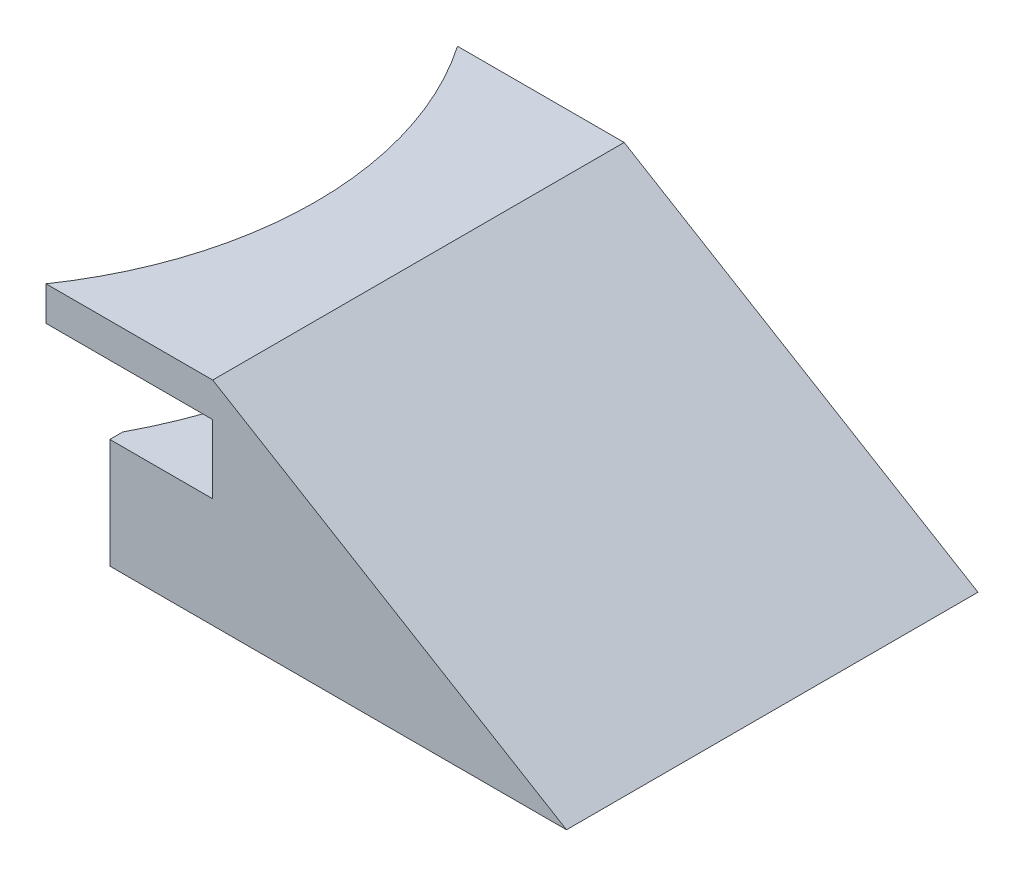
ISO-10303-21;
HEADER;
FILE_DESCRIPTION(('STEP AP214'),'2;1');
FILE_NAME('part.step','',(''),(''),'','','');
FILE_SCHEMA(('AUTOMOTIVE_DESIGN { 1 0 10303 214 1 1 1 1 }'));
ENDSEC;
DATA;
#1=APPLICATION_CONTEXT('core data for automotive mechanical design processes');
#2=APPLICATION_PROTOCOL_DEFINITION('international standard','automotive_design',2000,#1);
#3=PRODUCT_CONTEXT('',#1,'mechanical');
#4=PRODUCT('Part','Part','',(#3));
#5=PRODUCT_RELATED_PRODUCT_CATEGORY('part','',(#4));
#6=PRODUCT_DEFINITION_FORMATION('','',#4);
#7=PRODUCT_DEFINITION_CONTEXT('part definition',#1,'design');
#8=PRODUCT_DEFINITION('design','',#6,#7);
#9=PRODUCT_DEFINITION_SHAPE('','',#8);
#10=(LENGTH_UNIT() NAMED_UNIT(*) SI_UNIT(.MILLI.,.METRE.));
#11=(NAMED_UNIT(*) PLANE_ANGLE_UNIT() SI_UNIT($,.RADIAN.));
#12=(NAMED_UNIT(*) SI_UNIT($,.STERADIAN.) SOLID_ANGLE_UNIT());
#13=UNCERTAINTY_MEASURE_WITH_UNIT(LENGTH_MEASURE(1.E-05),#10,'distance_accuracy_value','');
#14=(GEOMETRIC_REPRESENTATION_CONTEXT(3) GLOBAL_UNCERTAINTY_ASSIGNED_CONTEXT((#13)) GLOBAL_UNIT_ASSIGNED_CONTEXT((#10,
#11,#12)) REPRESENTATION_CONTEXT('',''));
#15=CARTESIAN_POINT('',(0.,0.,0.));
#16=DIRECTION('',(0.,0.,1.));
#17=DIRECTION('',(1.,0.,0.));
#18=AXIS2_PLACEMENT_3D('',#15,#16,#17);
#19=CARTESIAN_POINT('',(-15.,16.,60.));
#20=DIRECTION('',(1.,0.,0.));
#21=DIRECTION('',(0.,0.,-1.));
#22=AXIS2_PLACEMENT_3D('',#19,#20,#21);
#23=PLANE('',#22);
#24=DIRECTION('',(0.,0.,-1.));
#25=VECTOR('',#24,1.);
#26=CARTESIAN_POINT('',(-15.,16.,60.));
#27=LINE('',#26,#25);
#28=CARTESIAN_POINT('',(-15.,16.,60.));
#29=VERTEX_POINT('',#28);
#30=CARTESIAN_POINT('',(-15.,16.,58.1247222208505));
#31=VERTEX_POINT('',#30);
#32=EDGE_CURVE('E126',#29,#31,#27,.T.);
#33=ORIENTED_EDGE('',*,*,#32,.T.);
#34=DIRECTION('',(0.,-1.,0.));
#35=VECTOR('',#34,1.);
#36=CARTESIAN_POINT('',(-15.,21.,58.1247222208505));
#37=LINE('',#36,#35);
#38=CARTESIAN_POINT('',(-15.,0.,58.1247222208505));
#39=VERTEX_POINT('',#38);
#40=EDGE_CURVE('E113',#31,#39,#37,.T.);
#41=ORIENTED_EDGE('',*,*,#40,.T.);
#42=DIRECTION('',(0.,0.,-1.));
#43=VECTOR('',#42,1.);
#44=CARTESIAN_POINT('',(-15.,0.,60.));
#45=LINE('',#44,#43);
#46=CARTESIAN_POINT('',(-15.,0.,60.));
#47=VERTEX_POINT('',#46);
#48=EDGE_CURVE('E123',#47,#39,#45,.T.);
#49=ORIENTED_EDGE('',*,*,#48,.F.);
#50=DIRECTION('',(0.,-1.,0.));
#51=VECTOR('',#50,1.);
#52=CARTESIAN_POINT('',(-15.,16.,60.));
#53=LINE('',#52,#51);
#54=EDGE_CURVE('E192',#29,#47,#53,.T.);
#55=ORIENTED_EDGE('',*,*,#54,.F.);
#56=EDGE_LOOP('',(#33,#41,#49,#55));
#57=FACE_BOUND('',#56,.T.);
#58=ADVANCED_FACE('F37',(#57),#23,.F.);
#59=CARTESIAN_POINT('',(-65.,26.,60.));
#60=DIRECTION('',(0.,1.,0.));
#61=DIRECTION('',(0.,0.,1.));
#62=AXIS2_PLACEMENT_3D('',#59,#60,#61);
#63=PLANE('',#62);
#64=DIRECTION('',(1.,0.,0.));
#65=VECTOR('',#64,1.);
#66=CARTESIAN_POINT('',(-65.,26.,60.));
#67=LINE('',#66,#65);
#68=CARTESIAN_POINT('',(-24.307895450093,26.,60.));
#69=VERTEX_POINT('',#68);
#70=CARTESIAN_POINT('',(0.,26.,60.));
#71=VERTEX_POINT('',#70);
#72=EDGE_CURVE('E176',#69,#71,#67,.T.);
#73=ORIENTED_EDGE('',*,*,#72,.F.);
#74=CARTESIAN_POINT('',(-68.,26.,30.));
#75=DIRECTION('',(0.,1.,0.));
#76=DIRECTION('',(0.,0.,1.));
#77=AXIS2_PLACEMENT_3D('',#74,#75,#76);
#78=CIRCLE('',#77,53.);
#79=CARTESIAN_POINT('',(-24.307895450093,26.,0.));
#80=VERTEX_POINT('',#79);
#81=EDGE_CURVE('E199',#69,#80,#78,.T.);
#82=ORIENTED_EDGE('',*,*,#81,.T.);
#83=DIRECTION('',(1.,0.,0.));
#84=VECTOR('',#83,1.);
#85=CARTESIAN_POINT('',(-65.,26.,0.));
#86=LINE('',#85,#84);
#87=CARTESIAN_POINT('',(0.,26.,0.));
#88=VERTEX_POINT('',#87);
#89=EDGE_CURVE('E157',#80,#88,#86,.T.);
#90=ORIENTED_EDGE('',*,*,#89,.T.);
#91=DIRECTION('',(0.,0.,-1.));
#92=VECTOR('',#91,1.);
#93=CARTESIAN_POINT('',(0.,26.,60.));
#94=LINE('',#93,#92);
#95=EDGE_CURVE('E45',#71,#88,#94,.T.);
#96=ORIENTED_EDGE('',*,*,#95,.F.);
#97=EDGE_LOOP('',(#73,#82,#90,#96));
#98=FACE_BOUND('',#97,.T.);
#99=ADVANCED_FACE('F39',(#98),#63,.F.);
#100=CARTESIAN_POINT('',(0.,26.,60.));
#101=DIRECTION('',(1.,0.,0.));
#102=DIRECTION('',(0.,1.,0.));
#103=AXIS2_PLACEMENT_3D('',#100,#101,#102);
#104=PLANE('',#103);
#105=DIRECTION('',(0.,-1.,0.));
#106=VECTOR('',#105,1.);
#107=CARTESIAN_POINT('',(0.,26.,0.));
#108=LINE('',#107,#106);
#109=CARTESIAN_POINT('',(0.,16.,0.));
#110=VERTEX_POINT('',#109);
#111=EDGE_CURVE('E149',#88,#110,#108,.T.);
#112=ORIENTED_EDGE('',*,*,#111,.T.);
#113=DIRECTION('',(0.,0.,-1.));
#114=VECTOR('',#113,1.);
#115=CARTESIAN_POINT('',(0.,16.,60.));
#116=LINE('',#115,#114);
#117=CARTESIAN_POINT('',(0.,16.,60.));
#118=VERTEX_POINT('',#117);
#119=EDGE_CURVE('E140',#118,#110,#116,.T.);
#120=ORIENTED_EDGE('',*,*,#119,.F.);
#121=DIRECTION('',(0.,-1.,0.));
#122=VECTOR('',#121,1.);
#123=CARTESIAN_POINT('',(0.,26.,60.));
#124=LINE('',#123,#122);
#125=EDGE_CURVE('E150',#71,#118,#124,.T.);
#126=ORIENTED_EDGE('',*,*,#125,.F.);
#127=ORIENTED_EDGE('',*,*,#95,.T.);
#128=EDGE_LOOP('',(#112,#120,#126,#127));
#129=FACE_BOUND('',#128,.T.);
#130=ADVANCED_FACE('F147',(#129),#104,.F.);
#131=CARTESIAN_POINT('',(0.,16.,60.));
#132=DIRECTION('',(0.,-1.,0.));
#133=DIRECTION('',(1.,0.,0.));
#134=AXIS2_PLACEMENT_3D('',#131,#132,#133);
#135=PLANE('',#134);
#136=CARTESIAN_POINT('',(-15.,16.,1.87527777914953));
#137=VERTEX_POINT('',#136);
#138=CARTESIAN_POINT('',(-15.,16.,0.));
#139=VERTEX_POINT('',#138);
#140=EDGE_CURVE('E132',#137,#139,#27,.T.);
#141=ORIENTED_EDGE('',*,*,#140,.F.);
#142=CARTESIAN_POINT('',(-68.,16.,30.));
#143=DIRECTION('',(0.,-1.,0.));
#144=DIRECTION('',(1.,0.,0.));
#145=AXIS2_PLACEMENT_3D('',#142,#143,#144);
#146=CIRCLE('',#145,60.);
#147=EDGE_CURVE('E127',#137,#31,#146,.T.);
#148=ORIENTED_EDGE('',*,*,#147,.T.);
#149=ORIENTED_EDGE('',*,*,#32,.F.);
#150=DIRECTION('',(-1.,0.,0.));
#151=VECTOR('',#150,1.);
#152=CARTESIAN_POINT('',(0.,16.,60.));
#153=LINE('',#152,#151);
#154=EDGE_CURVE('E194',#118,#29,#153,.T.);
#155=ORIENTED_EDGE('',*,*,#154,.F.);
#156=ORIENTED_EDGE('',*,*,#119,.T.);
#157=DIRECTION('',(-1.,0.,0.));
#158=VECTOR('',#157,1.);
#159=CARTESIAN_POINT('',(0.,16.,0.));
#160=LINE('',#159,#158);
#161=EDGE_CURVE('E160',#110,#139,#160,.T.);
#162=ORIENTED_EDGE('',*,*,#161,.T.);
#163=EDGE_LOOP('',(#141,#148,#149,#155,#156,#162));
#164=FACE_BOUND('',#163,.T.);
#165=ADVANCED_FACE('F208',(#164),#135,.F.);
#166=CARTESIAN_POINT('',(-15.,0.,1.87527777914953));
#167=VERTEX_POINT('',#166);
#168=CARTESIAN_POINT('',(-15.,0.,0.));
#169=VERTEX_POINT('',#168);
#170=EDGE_CURVE('E133',#167,#169,#45,.T.);
#171=ORIENTED_EDGE('',*,*,#170,.F.);
#172=DIRECTION('',(0.,-1.,0.));
#173=VECTOR('',#172,1.);
#174=CARTESIAN_POINT('',(-15.,21.,1.87527777914953));
#175=LINE('',#174,#173);
#176=EDGE_CURVE('E52',#167,#137,#175,.F.);
#177=ORIENTED_EDGE('',*,*,#176,.T.);
#178=ORIENTED_EDGE('',*,*,#140,.T.);
#179=DIRECTION('',(0.,-1.,0.));
#180=VECTOR('',#179,1.);
#181=CARTESIAN_POINT('',(-15.,16.,0.));
#182=LINE('',#181,#180);
#183=EDGE_CURVE('E162',#139,#169,#182,.T.);
#184=ORIENTED_EDGE('',*,*,#183,.T.);
#185=EDGE_LOOP('',(#171,#177,#178,#184));
#186=FACE_BOUND('',#185,.T.);
#187=ADVANCED_FACE('F206',(#186),#23,.F.);
#188=CARTESIAN_POINT('',(-15.,0.,60.));
#189=DIRECTION('',(0.,1.,0.));
#190=DIRECTION('',(-1.,0.,0.));
#191=AXIS2_PLACEMENT_3D('',#188,#189,#190);
#192=PLANE('',#191);
#193=ORIENTED_EDGE('',*,*,#48,.T.);
#194=CARTESIAN_POINT('',(-68.,0.,30.));
#195=DIRECTION('',(0.,-1.,0.));
#196=DIRECTION('',(0.,0.,-1.));
#197=AXIS2_PLACEMENT_3D('',#194,#195,#196);
#198=CIRCLE('',#197,60.);
#199=EDGE_CURVE('E110',#167,#39,#198,.T.);
#200=ORIENTED_EDGE('',*,*,#199,.F.);
#201=ORIENTED_EDGE('',*,*,#170,.T.);
#202=DIRECTION('',(1.,0.,0.));
#203=VECTOR('',#202,1.);
#204=CARTESIAN_POINT('',(-15.,0.,0.));
#205=LINE('',#204,#203);
#206=CARTESIAN_POINT('',(51.5926639528659,0.,0.));
#207=VERTEX_POINT('',#206);
#208=EDGE_CURVE('E170',#169,#207,#205,.T.);
#209=ORIENTED_EDGE('',*,*,#208,.T.);
#210=DIRECTION('',(0.,0.,-1.));
#211=VECTOR('',#210,1.);
#212=CARTESIAN_POINT('',(51.5926639528659,0.,60.));
#213=LINE('',#212,#211);
#214=CARTESIAN_POINT('',(51.5926639528659,0.,60.));
#215=VERTEX_POINT('',#214);
#216=EDGE_CURVE('E136',#215,#207,#213,.T.);
#217=ORIENTED_EDGE('',*,*,#216,.F.);
#218=DIRECTION('',(1.,0.,0.));
#219=VECTOR('',#218,1.);
#220=CARTESIAN_POINT('',(-15.,0.,60.));
#221=LINE('',#220,#219);
#222=EDGE_CURVE('E131',#47,#215,#221,.T.);
#223=ORIENTED_EDGE('',*,*,#222,.F.);
#224=EDGE_LOOP('',(#193,#200,#201,#209,#217,#223));
#225=FACE_BOUND('',#224,.T.);
#226=ADVANCED_FACE('F129',(#225),#192,.F.);
#227=CARTESIAN_POINT('',(51.5926639528659,0.,60.));
#228=DIRECTION('',(-0.515038074910055,-0.857167300702112,0.));
#229=DIRECTION('',(0.857167300702112,-0.515038074910055,0.));
#230=AXIS2_PLACEMENT_3D('',#227,#228,#229);
#231=PLANE('',#230);
#232=DIRECTION('',(-0.857167300702112,0.515038074910055,0.));
#233=VECTOR('',#232,1.);
#234=CARTESIAN_POINT('',(51.5926639528659,0.,0.));
#235=LINE('',#234,#233);
#236=CARTESIAN_POINT('',(0.,31.,0.));
#237=VERTEX_POINT('',#236);
#238=EDGE_CURVE('E172',#207,#237,#235,.T.);
#239=ORIENTED_EDGE('',*,*,#238,.T.);
#240=DIRECTION('',(0.,0.,-1.));
#241=VECTOR('',#240,1.);
#242=CARTESIAN_POINT('',(0.,31.,60.));
#243=LINE('',#242,#241);
#244=CARTESIAN_POINT('',(0.,31.,60.));
#245=VERTEX_POINT('',#244);
#246=EDGE_CURVE('E177',#245,#237,#243,.T.);
#247=ORIENTED_EDGE('',*,*,#246,.F.);
#248=DIRECTION('',(-0.857167300702112,0.515038074910055,0.));
#249=VECTOR('',#248,1.);
#250=CARTESIAN_POINT('',(51.5926639528659,0.,60.));
#251=LINE('',#250,#249);
#252=EDGE_CURVE('E186',#215,#245,#251,.T.);
#253=ORIENTED_EDGE('',*,*,#252,.F.);
#254=ORIENTED_EDGE('',*,*,#216,.T.);
#255=EDGE_LOOP('',(#239,#247,#253,#254));
#256=FACE_BOUND('',#255,.T.);
#257=ADVANCED_FACE('F214',(#256),#231,.F.);
#258=CARTESIAN_POINT('',(0.,31.,60.));
#259=DIRECTION('',(0.,-1.,0.));
#260=DIRECTION('',(1.,0.,0.));
#261=AXIS2_PLACEMENT_3D('',#258,#259,#260);
#262=PLANE('',#261);
#263=DIRECTION('',(-1.,0.,0.));
#264=VECTOR('',#263,1.);
#265=CARTESIAN_POINT('',(0.,31.,0.));
#266=LINE('',#265,#264);
#267=CARTESIAN_POINT('',(-24.307895450093,31.,0.));
#268=VERTEX_POINT('',#267);
#269=EDGE_CURVE('E174',#237,#268,#266,.T.);
#270=ORIENTED_EDGE('',*,*,#269,.T.);
#271=CARTESIAN_POINT('',(-68.,31.,30.));
#272=DIRECTION('',(0.,1.,0.));
#273=DIRECTION('',(-1.,0.,0.));
#274=AXIS2_PLACEMENT_3D('',#271,#272,#273);
#275=CIRCLE('',#274,53.);
#276=CARTESIAN_POINT('',(-24.307895450093,31.,60.));
#277=VERTEX_POINT('',#276);
#278=EDGE_CURVE('E60',#277,#268,#275,.T.);
#279=ORIENTED_EDGE('',*,*,#278,.F.);
#280=DIRECTION('',(-1.,0.,0.));
#281=VECTOR('',#280,1.);
#282=CARTESIAN_POINT('',(0.,31.,60.));
#283=LINE('',#282,#281);
#284=EDGE_CURVE('E179',#245,#277,#283,.T.);
#285=ORIENTED_EDGE('',*,*,#284,.F.);
#286=ORIENTED_EDGE('',*,*,#246,.T.);
#287=EDGE_LOOP('',(#270,#279,#285,#286));
#288=FACE_BOUND('',#287,.T.);
#289=ADVANCED_FACE('F217',(#288),#262,.F.);
#290=CARTESIAN_POINT('',(0.,0.,60.));
#291=DIRECTION('',(0.,0.,1.));
#292=DIRECTION('',(1.,0.,0.));
#293=AXIS2_PLACEMENT_3D('',#290,#291,#292);
#294=PLANE('',#293);
#295=DIRECTION('',(0.,1.,0.));
#296=VECTOR('',#295,1.);
#297=CARTESIAN_POINT('',(-24.307895450093,-29.,60.));
#298=LINE('',#297,#296);
#299=EDGE_CURVE('E164',#69,#277,#298,.T.);
#300=ORIENTED_EDGE('',*,*,#299,.F.);
#301=ORIENTED_EDGE('',*,*,#72,.T.);
#302=ORIENTED_EDGE('',*,*,#125,.T.);
#303=ORIENTED_EDGE('',*,*,#154,.T.);
#304=ORIENTED_EDGE('',*,*,#54,.T.);
#305=ORIENTED_EDGE('',*,*,#222,.T.);
#306=ORIENTED_EDGE('',*,*,#252,.T.);
#307=ORIENTED_EDGE('',*,*,#284,.T.);
#308=EDGE_LOOP('',(#300,#301,#302,#303,#304,#305,#306,#307));
#309=FACE_BOUND('',#308,.T.);
#310=ADVANCED_FACE('F215',(#309),#294,.T.);
#311=CARTESIAN_POINT('',(0.,0.,0.));
#312=DIRECTION('',(0.,0.,1.));
#313=DIRECTION('',(1.,0.,0.));
#314=AXIS2_PLACEMENT_3D('',#311,#312,#313);
#315=PLANE('',#314);
#316=ORIENTED_EDGE('',*,*,#89,.F.);
#317=DIRECTION('',(0.,1.,0.));
#318=VECTOR('',#317,1.);
#319=CARTESIAN_POINT('',(-24.307895450093,-29.,0.));
#320=LINE('',#319,#318);
#321=EDGE_CURVE('E11',#80,#268,#320,.T.);
#322=ORIENTED_EDGE('',*,*,#321,.T.);
#323=ORIENTED_EDGE('',*,*,#269,.F.);
#324=ORIENTED_EDGE('',*,*,#238,.F.);
#325=ORIENTED_EDGE('',*,*,#208,.F.);
#326=ORIENTED_EDGE('',*,*,#183,.F.);
#327=ORIENTED_EDGE('',*,*,#161,.F.);
#328=ORIENTED_EDGE('',*,*,#111,.F.);
#329=EDGE_LOOP('',(#316,#322,#323,#324,#325,#326,#327,#328));
#330=FACE_BOUND('',#329,.T.);
#331=ADVANCED_FACE('F156',(#330),#315,.F.);
#332=CARTESIAN_POINT('',(-68.,-29.,30.));
#333=DIRECTION('',(0.,1.,0.));
#334=DIRECTION('',(-1.,0.,0.));
#335=AXIS2_PLACEMENT_3D('',#332,#333,#334);
#336=CYLINDRICAL_SURFACE('',#335,53.);
#337=ORIENTED_EDGE('',*,*,#299,.T.);
#338=ORIENTED_EDGE('',*,*,#278,.T.);
#339=ORIENTED_EDGE('',*,*,#321,.F.);
#340=ORIENTED_EDGE('',*,*,#81,.F.);
#341=EDGE_LOOP('',(#337,#338,#339,#340));
#342=FACE_BOUND('',#341,.T.);
#343=ADVANCED_FACE('F216',(#342),#336,.F.);
#344=CARTESIAN_POINT('',(-68.,21.,30.));
#345=DIRECTION('',(0.,-1.,0.));
#346=DIRECTION('',(0.,0.,-1.));
#347=AXIS2_PLACEMENT_3D('',#344,#345,#346);
#348=CYLINDRICAL_SURFACE('',#347,60.);
#349=ORIENTED_EDGE('',*,*,#147,.F.);
#350=ORIENTED_EDGE('',*,*,#176,.F.);
#351=ORIENTED_EDGE('',*,*,#199,.T.);
#352=ORIENTED_EDGE('',*,*,#40,.F.);
#353=EDGE_LOOP('',(#349,#350,#351,#352));
#354=FACE_BOUND('',#353,.T.);
#355=ADVANCED_FACE('F112',(#354),#348,.F.);
#356=CLOSED_SHELL('',(#58,#99,#130,#165,#187,#226,#257,#289,#310,#331,#343,#355));
#357=MANIFOLD_SOLID_BREP('B2',#356);
#358=ADVANCED_BREP_SHAPE_REPRESENTATION('',(#18,#357),#14);
#359=SHAPE_DEFINITION_REPRESENTATION(#9,#358);
ENDSEC;
END-ISO-10303-21;
